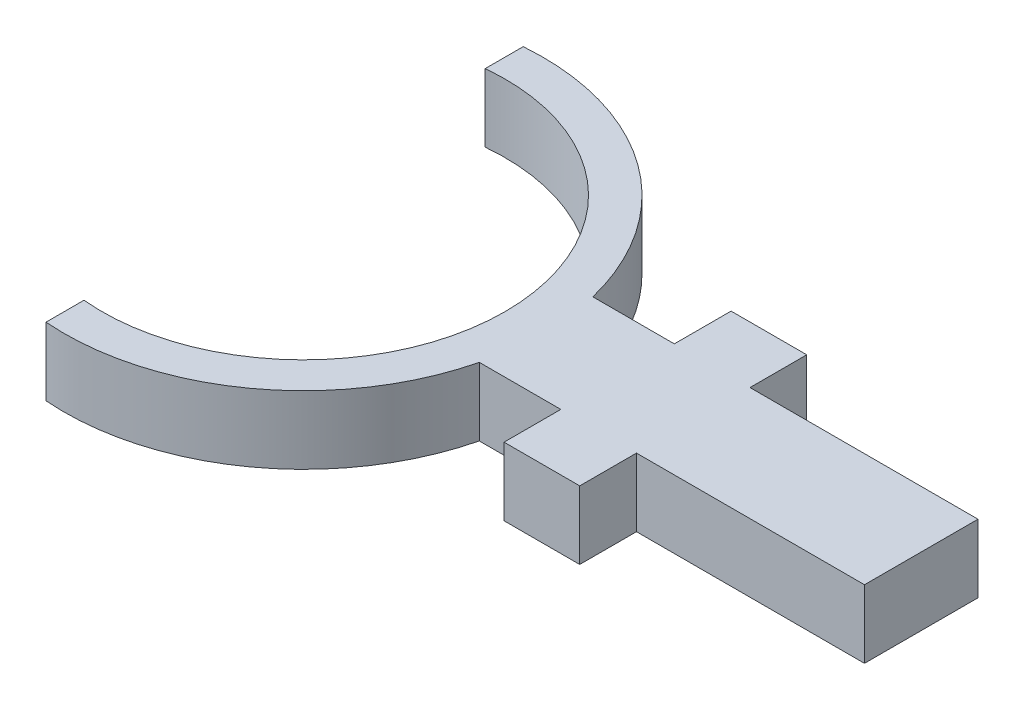
ISO-10303-21;
HEADER;
FILE_DESCRIPTION(('STEP AP214'),'2;1');
FILE_NAME('part.step','',(''),(''),'','','');
FILE_SCHEMA(('AUTOMOTIVE_DESIGN { 1 0 10303 214 1 1 1 1 }'));
ENDSEC;
DATA;
#1=APPLICATION_CONTEXT('core data for automotive mechanical design processes');
#2=APPLICATION_PROTOCOL_DEFINITION('international standard','automotive_design',2000,#1);
#3=PRODUCT_CONTEXT('',#1,'mechanical');
#4=PRODUCT('Part','Part','',(#3));
#5=PRODUCT_RELATED_PRODUCT_CATEGORY('part','',(#4));
#6=PRODUCT_DEFINITION_FORMATION('','',#4);
#7=PRODUCT_DEFINITION_CONTEXT('part definition',#1,'design');
#8=PRODUCT_DEFINITION('design','',#6,#7);
#9=PRODUCT_DEFINITION_SHAPE('','',#8);
#10=(LENGTH_UNIT() NAMED_UNIT(*) SI_UNIT(.MILLI.,.METRE.));
#11=(NAMED_UNIT(*) PLANE_ANGLE_UNIT() SI_UNIT($,.RADIAN.));
#12=(NAMED_UNIT(*) SI_UNIT($,.STERADIAN.) SOLID_ANGLE_UNIT());
#13=UNCERTAINTY_MEASURE_WITH_UNIT(LENGTH_MEASURE(1.E-05),#10,'distance_accuracy_value','');
#14=(GEOMETRIC_REPRESENTATION_CONTEXT(3) GLOBAL_UNCERTAINTY_ASSIGNED_CONTEXT((#13)) GLOBAL_UNIT_ASSIGNED_CONTEXT((#10,
#11,#12)) REPRESENTATION_CONTEXT('',''));
#15=CARTESIAN_POINT('',(0.,0.,0.));
#16=DIRECTION('',(0.,0.,1.));
#17=DIRECTION('',(1.,0.,0.));
#18=AXIS2_PLACEMENT_3D('',#15,#16,#17);
#19=CARTESIAN_POINT('',(5.82615267205284,1.8,1.5));
#20=DIRECTION('',(0.,0.,1.));
#21=DIRECTION('',(0.,-1.,0.));
#22=AXIS2_PLACEMENT_3D('',#19,#20,#21);
#23=PLANE('',#22);
#24=DIRECTION('',(0.,1.,0.));
#25=VECTOR('',#24,1.);
#26=CARTESIAN_POINT('',(10.3,1.8,1.5));
#27=LINE('',#26,#25);
#28=CARTESIAN_POINT('',(10.3,0.,1.5));
#29=VERTEX_POINT('',#28);
#30=CARTESIAN_POINT('',(10.3,1.8,1.5));
#31=VERTEX_POINT('',#30);
#32=EDGE_CURVE('E194',#29,#31,#27,.T.);
#33=ORIENTED_EDGE('',*,*,#32,.F.);
#34=DIRECTION('',(1.,0.,0.));
#35=VECTOR('',#34,1.);
#36=CARTESIAN_POINT('',(5.82615267205284,0.,1.5));
#37=LINE('',#36,#35);
#38=CARTESIAN_POINT('',(16.3261526720528,0.,1.5));
#39=VERTEX_POINT('',#38);
#40=EDGE_CURVE('E224',#29,#39,#37,.T.);
#41=ORIENTED_EDGE('',*,*,#40,.T.);
#42=DIRECTION('',(0.,-1.,0.));
#43=VECTOR('',#42,1.);
#44=CARTESIAN_POINT('',(16.3261526720528,1.8,1.5));
#45=LINE('',#44,#43);
#46=CARTESIAN_POINT('',(16.3261526720528,1.8,1.5));
#47=VERTEX_POINT('',#46);
#48=EDGE_CURVE('E212',#47,#39,#45,.T.);
#49=ORIENTED_EDGE('',*,*,#48,.F.);
#50=DIRECTION('',(1.,0.,0.));
#51=VECTOR('',#50,1.);
#52=CARTESIAN_POINT('',(5.82615267205284,1.8,1.5));
#53=LINE('',#52,#51);
#54=EDGE_CURVE('E50',#31,#47,#53,.T.);
#55=ORIENTED_EDGE('',*,*,#54,.F.);
#56=EDGE_LOOP('',(#33,#41,#49,#55));
#57=FACE_BOUND('',#56,.T.);
#58=ADVANCED_FACE('F35',(#57),#23,.T.);
#59=CARTESIAN_POINT('',(5.82615267205284,1.8,-1.5));
#60=DIRECTION('',(0.,0.,-1.));
#61=DIRECTION('',(0.,1.,0.));
#62=AXIS2_PLACEMENT_3D('',#59,#60,#61);
#63=PLANE('',#62);
#64=DIRECTION('',(0.,-1.,0.));
#65=VECTOR('',#64,1.);
#66=CARTESIAN_POINT('',(10.3,1.8,-1.5));
#67=LINE('',#66,#65);
#68=CARTESIAN_POINT('',(10.3,1.8,-1.5));
#69=VERTEX_POINT('',#68);
#70=CARTESIAN_POINT('',(10.3,0.,-1.5));
#71=VERTEX_POINT('',#70);
#72=EDGE_CURVE('E11',#69,#71,#67,.T.);
#73=ORIENTED_EDGE('',*,*,#72,.F.);
#74=DIRECTION('',(1.,0.,0.));
#75=VECTOR('',#74,1.);
#76=CARTESIAN_POINT('',(5.82615267205284,1.8,-1.5));
#77=LINE('',#76,#75);
#78=CARTESIAN_POINT('',(16.3261526720528,1.8,-1.5));
#79=VERTEX_POINT('',#78);
#80=EDGE_CURVE('E157',#69,#79,#77,.T.);
#81=ORIENTED_EDGE('',*,*,#80,.T.);
#82=DIRECTION('',(0.,1.,0.));
#83=VECTOR('',#82,1.);
#84=CARTESIAN_POINT('',(16.3261526720528,1.8,-1.5));
#85=LINE('',#84,#83);
#86=CARTESIAN_POINT('',(16.3261526720528,0.,-1.5));
#87=VERTEX_POINT('',#86);
#88=EDGE_CURVE('E218',#87,#79,#85,.T.);
#89=ORIENTED_EDGE('',*,*,#88,.F.);
#90=DIRECTION('',(1.,0.,0.));
#91=VECTOR('',#90,1.);
#92=CARTESIAN_POINT('',(5.82615267205284,0.,-1.5));
#93=LINE('',#92,#91);
#94=EDGE_CURVE('E234',#71,#87,#93,.T.);
#95=ORIENTED_EDGE('',*,*,#94,.F.);
#96=EDGE_LOOP('',(#73,#81,#89,#95));
#97=FACE_BOUND('',#96,.T.);
#98=ADVANCED_FACE('F309',(#97),#63,.T.);
#99=CARTESIAN_POINT('',(0.,1.8,0.));
#100=DIRECTION('',(0.,-1.,0.));
#101=DIRECTION('',(0.,0.,-1.));
#102=AXIS2_PLACEMENT_3D('',#99,#100,#101);
#103=CYLINDRICAL_SURFACE('',#102,6.32615267205284);
#104=CARTESIAN_POINT('',(0.,1.8,0.));
#105=DIRECTION('',(0.,1.,0.));
#106=DIRECTION('',(0.,0.,1.));
#107=AXIS2_PLACEMENT_3D('',#104,#105,#106);
#108=CIRCLE('',#107,6.32615267205284);
#109=CARTESIAN_POINT('',(-0.499999999999999,1.8,6.30636247214837));
#110=VERTEX_POINT('',#109);
#111=CARTESIAN_POINT('',(6.14574711732604,1.8,1.5));
#112=VERTEX_POINT('',#111);
#113=EDGE_CURVE('E247',#110,#112,#108,.T.);
#114=ORIENTED_EDGE('',*,*,#113,.F.);
#115=DIRECTION('',(0.,-1.,0.));
#116=VECTOR('',#115,1.);
#117=CARTESIAN_POINT('',(-0.499999999999999,1.8,6.30636247214837));
#118=LINE('',#117,#116);
#119=CARTESIAN_POINT('',(-0.499999999999999,0.,6.30636247214837));
#120=VERTEX_POINT('',#119);
#121=EDGE_CURVE('E204',#120,#110,#118,.F.);
#122=ORIENTED_EDGE('',*,*,#121,.F.);
#123=CARTESIAN_POINT('',(0.,0.,0.));
#124=DIRECTION('',(0.,1.,0.));
#125=DIRECTION('',(0.,0.,1.));
#126=AXIS2_PLACEMENT_3D('',#123,#124,#125);
#127=CIRCLE('',#126,6.32615267205284);
#128=CARTESIAN_POINT('',(6.14574711732604,0.,1.5));
#129=VERTEX_POINT('',#128);
#130=EDGE_CURVE('E240',#120,#129,#127,.T.);
#131=ORIENTED_EDGE('',*,*,#130,.T.);
#132=DIRECTION('',(0.,-1.,0.));
#133=VECTOR('',#132,1.);
#134=CARTESIAN_POINT('',(6.14574711732604,1.8,1.5));
#135=LINE('',#134,#133);
#136=EDGE_CURVE('E253',#129,#112,#135,.F.);
#137=ORIENTED_EDGE('',*,*,#136,.T.);
#138=EDGE_LOOP('',(#114,#122,#131,#137));
#139=FACE_BOUND('',#138,.T.);
#140=ADVANCED_FACE('F285',(#139),#103,.T.);
#141=CARTESIAN_POINT('',(0.,1.8,0.));
#142=DIRECTION('',(0.,1.,0.));
#143=DIRECTION('',(0.,0.,1.));
#144=AXIS2_PLACEMENT_3D('',#141,#142,#143);
#145=PLANE('',#144);
#146=CARTESIAN_POINT('',(8.3,1.8,1.5));
#147=VERTEX_POINT('',#146);
#148=EDGE_CURVE('E225',#112,#147,#53,.T.);
#149=ORIENTED_EDGE('',*,*,#148,.T.);
#150=DIRECTION('',(0.,0.,1.));
#151=VECTOR('',#150,1.);
#152=CARTESIAN_POINT('',(8.3,1.8,-3.));
#153=LINE('',#152,#151);
#154=CARTESIAN_POINT('',(8.3,1.8,3.));
#155=VERTEX_POINT('',#154);
#156=EDGE_CURVE('E175',#147,#155,#153,.T.);
#157=ORIENTED_EDGE('',*,*,#156,.T.);
#158=DIRECTION('',(1.,0.,0.));
#159=VECTOR('',#158,1.);
#160=CARTESIAN_POINT('',(10.3,1.8,3.));
#161=LINE('',#160,#159);
#162=CARTESIAN_POINT('',(10.3,1.8,3.));
#163=VERTEX_POINT('',#162);
#164=EDGE_CURVE('E170',#155,#163,#161,.T.);
#165=ORIENTED_EDGE('',*,*,#164,.T.);
#166=DIRECTION('',(0.,0.,-1.));
#167=VECTOR('',#166,1.);
#168=CARTESIAN_POINT('',(10.3,1.8,-3.));
#169=LINE('',#168,#167);
#170=EDGE_CURVE('E160',#163,#31,#169,.T.);
#171=ORIENTED_EDGE('',*,*,#170,.T.);
#172=ORIENTED_EDGE('',*,*,#54,.T.);
#173=DIRECTION('',(0.,0.,1.));
#174=VECTOR('',#173,1.);
#175=CARTESIAN_POINT('',(16.3261526720528,1.8,1.5));
#176=LINE('',#175,#174);
#177=EDGE_CURVE('E221',#79,#47,#176,.T.);
#178=ORIENTED_EDGE('',*,*,#177,.F.);
#179=ORIENTED_EDGE('',*,*,#80,.F.);
#180=CARTESIAN_POINT('',(10.3,1.8,-3.));
#181=VERTEX_POINT('',#180);
#182=EDGE_CURVE('E150',#69,#181,#169,.T.);
#183=ORIENTED_EDGE('',*,*,#182,.T.);
#184=DIRECTION('',(-1.,0.,0.));
#185=VECTOR('',#184,1.);
#186=CARTESIAN_POINT('',(10.3,1.8,-3.));
#187=LINE('',#186,#185);
#188=CARTESIAN_POINT('',(8.3,1.8,-3.));
#189=VERTEX_POINT('',#188);
#190=EDGE_CURVE('E155',#181,#189,#187,.T.);
#191=ORIENTED_EDGE('',*,*,#190,.T.);
#192=CARTESIAN_POINT('',(8.3,1.8,-1.5));
#193=VERTEX_POINT('',#192);
#194=EDGE_CURVE('E177',#189,#193,#153,.T.);
#195=ORIENTED_EDGE('',*,*,#194,.T.);
#196=CARTESIAN_POINT('',(6.14574711732604,1.8,-1.5));
#197=VERTEX_POINT('',#196);
#198=EDGE_CURVE('E228',#197,#193,#77,.T.);
#199=ORIENTED_EDGE('',*,*,#198,.F.);
#200=CARTESIAN_POINT('',(-0.5,1.8,-6.30636247214837));
#201=VERTEX_POINT('',#200);
#202=EDGE_CURVE('E243',#197,#201,#108,.T.);
#203=ORIENTED_EDGE('',*,*,#202,.T.);
#204=DIRECTION('',(0.,0.,-1.));
#205=VECTOR('',#204,1.);
#206=CARTESIAN_POINT('',(-0.5,1.8,-7.53956639783701));
#207=LINE('',#206,#205);
#208=CARTESIAN_POINT('',(-0.5,1.8,-5.30263163778285));
#209=VERTEX_POINT('',#208);
#210=EDGE_CURVE('E206',#209,#201,#207,.T.);
#211=ORIENTED_EDGE('',*,*,#210,.F.);
#212=CARTESIAN_POINT('',(0.,1.8,0.));
#213=DIRECTION('',(0.,1.,0.));
#214=DIRECTION('',(0.,0.,1.));
#215=AXIS2_PLACEMENT_3D('',#212,#213,#214);
#216=CIRCLE('',#215,5.32615267205284);
#217=CARTESIAN_POINT('',(-0.499999999999999,1.8,5.30263163778285));
#218=VERTEX_POINT('',#217);
#219=EDGE_CURVE('E237',#218,#209,#216,.T.);
#220=ORIENTED_EDGE('',*,*,#219,.F.);
#221=EDGE_CURVE('E208',#110,#218,#207,.T.);
#222=ORIENTED_EDGE('',*,*,#221,.F.);
#223=ORIENTED_EDGE('',*,*,#113,.T.);
#224=EDGE_LOOP('',(#149,#157,#165,#171,#172,#178,#179,#183,#191,#195,#199,#203,#211,#220,#222,#223));
#225=FACE_BOUND('',#224,.T.);
#226=ADVANCED_FACE('F152',(#225),#145,.T.);
#227=CARTESIAN_POINT('',(0.,0.,0.));
#228=DIRECTION('',(0.,1.,0.));
#229=DIRECTION('',(0.,0.,1.));
#230=AXIS2_PLACEMENT_3D('',#227,#228,#229);
#231=PLANE('',#230);
#232=CARTESIAN_POINT('',(6.14574711732604,0.,-1.5));
#233=VERTEX_POINT('',#232);
#234=CARTESIAN_POINT('',(8.3,0.,-1.5));
#235=VERTEX_POINT('',#234);
#236=EDGE_CURVE('E231',#233,#235,#93,.T.);
#237=ORIENTED_EDGE('',*,*,#236,.T.);
#238=DIRECTION('',(0.,0.,-1.));
#239=VECTOR('',#238,1.);
#240=CARTESIAN_POINT('',(8.3,0.,-3.));
#241=LINE('',#240,#239);
#242=CARTESIAN_POINT('',(8.3,0.,-3.));
#243=VERTEX_POINT('',#242);
#244=EDGE_CURVE('E186',#235,#243,#241,.T.);
#245=ORIENTED_EDGE('',*,*,#244,.T.);
#246=DIRECTION('',(1.,0.,0.));
#247=VECTOR('',#246,1.);
#248=CARTESIAN_POINT('',(10.3,0.,-3.));
#249=LINE('',#248,#247);
#250=CARTESIAN_POINT('',(10.3,0.,-3.));
#251=VERTEX_POINT('',#250);
#252=EDGE_CURVE('E191',#243,#251,#249,.T.);
#253=ORIENTED_EDGE('',*,*,#252,.T.);
#254=DIRECTION('',(0.,0.,1.));
#255=VECTOR('',#254,1.);
#256=CARTESIAN_POINT('',(10.3,0.,-3.));
#257=LINE('',#256,#255);
#258=EDGE_CURVE('E166',#251,#71,#257,.T.);
#259=ORIENTED_EDGE('',*,*,#258,.T.);
#260=ORIENTED_EDGE('',*,*,#94,.T.);
#261=DIRECTION('',(0.,0.,-1.));
#262=VECTOR('',#261,1.);
#263=CARTESIAN_POINT('',(16.3261526720528,0.,1.5));
#264=LINE('',#263,#262);
#265=EDGE_CURVE('E215',#39,#87,#264,.T.);
#266=ORIENTED_EDGE('',*,*,#265,.F.);
#267=ORIENTED_EDGE('',*,*,#40,.F.);
#268=CARTESIAN_POINT('',(10.3,0.,3.));
#269=VERTEX_POINT('',#268);
#270=EDGE_CURVE('E302',#29,#269,#257,.T.);
#271=ORIENTED_EDGE('',*,*,#270,.T.);
#272=DIRECTION('',(-1.,0.,0.));
#273=VECTOR('',#272,1.);
#274=CARTESIAN_POINT('',(10.3,0.,3.));
#275=LINE('',#274,#273);
#276=CARTESIAN_POINT('',(8.3,0.,3.));
#277=VERTEX_POINT('',#276);
#278=EDGE_CURVE('E460',#269,#277,#275,.T.);
#279=ORIENTED_EDGE('',*,*,#278,.T.);
#280=CARTESIAN_POINT('',(8.3,0.,1.5));
#281=VERTEX_POINT('',#280);
#282=EDGE_CURVE('E293',#277,#281,#241,.T.);
#283=ORIENTED_EDGE('',*,*,#282,.T.);
#284=EDGE_CURVE('E235',#129,#281,#37,.T.);
#285=ORIENTED_EDGE('',*,*,#284,.F.);
#286=ORIENTED_EDGE('',*,*,#130,.F.);
#287=DIRECTION('',(0.,0.,1.));
#288=VECTOR('',#287,1.);
#289=CARTESIAN_POINT('',(-0.5,0.,-7.53956639783701));
#290=LINE('',#289,#288);
#291=CARTESIAN_POINT('',(-0.499999999999999,0.,5.30263163778285));
#292=VERTEX_POINT('',#291);
#293=EDGE_CURVE('E211',#292,#120,#290,.T.);
#294=ORIENTED_EDGE('',*,*,#293,.F.);
#295=CARTESIAN_POINT('',(0.,0.,0.));
#296=DIRECTION('',(0.,1.,0.));
#297=DIRECTION('',(0.,0.,1.));
#298=AXIS2_PLACEMENT_3D('',#295,#296,#297);
#299=CIRCLE('',#298,5.32615267205284);
#300=CARTESIAN_POINT('',(-0.5,0.,-5.30263163778285));
#301=VERTEX_POINT('',#300);
#302=EDGE_CURVE('E227',#292,#301,#299,.T.);
#303=ORIENTED_EDGE('',*,*,#302,.T.);
#304=CARTESIAN_POINT('',(-0.5,0.,-6.30636247214837));
#305=VERTEX_POINT('',#304);
#306=EDGE_CURVE('E209',#305,#301,#290,.T.);
#307=ORIENTED_EDGE('',*,*,#306,.F.);
#308=EDGE_CURVE('E248',#233,#305,#127,.T.);
#309=ORIENTED_EDGE('',*,*,#308,.F.);
#310=EDGE_LOOP('',(#237,#245,#253,#259,#260,#266,#267,#271,#279,#283,#285,#286,#294,#303,#307,#309));
#311=FACE_BOUND('',#310,.T.);
#312=ADVANCED_FACE('F278',(#311),#231,.F.);
#313=ORIENTED_EDGE('',*,*,#308,.T.);
#314=DIRECTION('',(0.,-1.,0.));
#315=VECTOR('',#314,1.);
#316=CARTESIAN_POINT('',(-0.5,1.8,-6.30636247214837));
#317=LINE('',#316,#315);
#318=EDGE_CURVE('E202',#201,#305,#317,.T.);
#319=ORIENTED_EDGE('',*,*,#318,.F.);
#320=ORIENTED_EDGE('',*,*,#202,.F.);
#321=DIRECTION('',(0.,-1.,0.));
#322=VECTOR('',#321,1.);
#323=CARTESIAN_POINT('',(6.14574711732604,1.8,-1.5));
#324=LINE('',#323,#322);
#325=EDGE_CURVE('E246',#197,#233,#324,.T.);
#326=ORIENTED_EDGE('',*,*,#325,.T.);
#327=EDGE_LOOP('',(#313,#319,#320,#326));
#328=FACE_BOUND('',#327,.T.);
#329=ADVANCED_FACE('F37',(#328),#103,.T.);
#330=CARTESIAN_POINT('',(0.,1.8,0.));
#331=DIRECTION('',(0.,-1.,0.));
#332=DIRECTION('',(0.,0.,-1.));
#333=AXIS2_PLACEMENT_3D('',#330,#331,#332);
#334=CYLINDRICAL_SURFACE('',#333,5.32615267205284);
#335=DIRECTION('',(0.,-1.,0.));
#336=VECTOR('',#335,1.);
#337=CARTESIAN_POINT('',(-0.499999999999999,1.8,5.30263163778285));
#338=LINE('',#337,#336);
#339=EDGE_CURVE('E199',#292,#218,#338,.F.);
#340=ORIENTED_EDGE('',*,*,#339,.T.);
#341=ORIENTED_EDGE('',*,*,#219,.T.);
#342=DIRECTION('',(0.,-1.,0.));
#343=VECTOR('',#342,1.);
#344=CARTESIAN_POINT('',(-0.5,1.8,-5.30263163778285));
#345=LINE('',#344,#343);
#346=EDGE_CURVE('E196',#209,#301,#345,.T.);
#347=ORIENTED_EDGE('',*,*,#346,.T.);
#348=ORIENTED_EDGE('',*,*,#302,.F.);
#349=EDGE_LOOP('',(#340,#341,#347,#348));
#350=FACE_BOUND('',#349,.T.);
#351=ADVANCED_FACE('F270',(#350),#334,.F.);
#352=DIRECTION('',(0.,-1.,0.));
#353=VECTOR('',#352,1.);
#354=CARTESIAN_POINT('',(8.3,1.8,1.5));
#355=LINE('',#354,#353);
#356=EDGE_CURVE('E58',#147,#281,#355,.T.);
#357=ORIENTED_EDGE('',*,*,#356,.F.);
#358=ORIENTED_EDGE('',*,*,#148,.F.);
#359=ORIENTED_EDGE('',*,*,#136,.F.);
#360=ORIENTED_EDGE('',*,*,#284,.T.);
#361=EDGE_LOOP('',(#357,#358,#359,#360));
#362=FACE_BOUND('',#361,.T.);
#363=ADVANCED_FACE('F286',(#362),#23,.T.);
#364=DIRECTION('',(0.,1.,0.));
#365=VECTOR('',#364,1.);
#366=CARTESIAN_POINT('',(8.3,1.8,-1.5));
#367=LINE('',#366,#365);
#368=EDGE_CURVE('E43',#235,#193,#367,.T.);
#369=ORIENTED_EDGE('',*,*,#368,.F.);
#370=ORIENTED_EDGE('',*,*,#236,.F.);
#371=ORIENTED_EDGE('',*,*,#325,.F.);
#372=ORIENTED_EDGE('',*,*,#198,.T.);
#373=EDGE_LOOP('',(#369,#370,#371,#372));
#374=FACE_BOUND('',#373,.T.);
#375=ADVANCED_FACE('F262',(#374),#63,.T.);
#376=CARTESIAN_POINT('',(16.3261526720528,0.,0.));
#377=DIRECTION('',(1.,0.,0.));
#378=DIRECTION('',(0.,0.,-1.));
#379=AXIS2_PLACEMENT_3D('',#376,#377,#378);
#380=PLANE('',#379);
#381=ORIENTED_EDGE('',*,*,#48,.T.);
#382=ORIENTED_EDGE('',*,*,#265,.T.);
#383=ORIENTED_EDGE('',*,*,#88,.T.);
#384=ORIENTED_EDGE('',*,*,#177,.T.);
#385=EDGE_LOOP('',(#381,#382,#383,#384));
#386=FACE_BOUND('',#385,.T.);
#387=ADVANCED_FACE('F307',(#386),#380,.T.);
#388=CARTESIAN_POINT('',(-0.5,-0.000999999999999916,-7.53956639783701));
#389=DIRECTION('',(1.,0.,0.));
#390=DIRECTION('',(0.,0.,-1.));
#391=AXIS2_PLACEMENT_3D('',#388,#389,#390);
#392=PLANE('',#391);
#393=ORIENTED_EDGE('',*,*,#318,.T.);
#394=ORIENTED_EDGE('',*,*,#306,.T.);
#395=ORIENTED_EDGE('',*,*,#346,.F.);
#396=ORIENTED_EDGE('',*,*,#210,.T.);
#397=EDGE_LOOP('',(#393,#394,#395,#396));
#398=FACE_BOUND('',#397,.T.);
#399=ADVANCED_FACE('F323',(#398),#392,.F.);
#400=ORIENTED_EDGE('',*,*,#121,.T.);
#401=ORIENTED_EDGE('',*,*,#221,.T.);
#402=ORIENTED_EDGE('',*,*,#339,.F.);
#403=ORIENTED_EDGE('',*,*,#293,.T.);
#404=EDGE_LOOP('',(#400,#401,#402,#403));
#405=FACE_BOUND('',#404,.T.);
#406=ADVANCED_FACE('F274',(#405),#392,.F.);
#407=CARTESIAN_POINT('',(10.3,-6.32455532033676,-3.));
#408=DIRECTION('',(0.,0.,-1.));
#409=DIRECTION('',(-1.,0.,0.));
#410=AXIS2_PLACEMENT_3D('',#407,#408,#409);
#411=PLANE('',#410);
#412=ORIENTED_EDGE('',*,*,#252,.F.);
#413=DIRECTION('',(0.,1.,0.));
#414=VECTOR('',#413,1.);
#415=CARTESIAN_POINT('',(8.3,-6.32455532033676,-3.));
#416=LINE('',#415,#414);
#417=EDGE_CURVE('E169',#243,#189,#416,.T.);
#418=ORIENTED_EDGE('',*,*,#417,.T.);
#419=ORIENTED_EDGE('',*,*,#190,.F.);
#420=DIRECTION('',(0.,1.,0.));
#421=VECTOR('',#420,1.);
#422=CARTESIAN_POINT('',(10.3,-6.32455532033676,-3.));
#423=LINE('',#422,#421);
#424=EDGE_CURVE('E164',#251,#181,#423,.T.);
#425=ORIENTED_EDGE('',*,*,#424,.F.);
#426=EDGE_LOOP('',(#412,#418,#419,#425));
#427=FACE_BOUND('',#426,.T.);
#428=ADVANCED_FACE('F172',(#427),#411,.T.);
#429=CARTESIAN_POINT('',(8.3,-6.32455532033676,-3.));
#430=DIRECTION('',(-1.,0.,0.));
#431=DIRECTION('',(0.,0.,1.));
#432=AXIS2_PLACEMENT_3D('',#429,#430,#431);
#433=PLANE('',#432);
#434=ORIENTED_EDGE('',*,*,#244,.F.);
#435=ORIENTED_EDGE('',*,*,#368,.T.);
#436=ORIENTED_EDGE('',*,*,#194,.F.);
#437=ORIENTED_EDGE('',*,*,#417,.F.);
#438=EDGE_LOOP('',(#434,#435,#436,#437));
#439=FACE_BOUND('',#438,.T.);
#440=ADVANCED_FACE('F257',(#439),#433,.T.);
#441=CARTESIAN_POINT('',(10.3,-6.32455532033676,-3.));
#442=DIRECTION('',(1.,0.,0.));
#443=DIRECTION('',(0.,0.,-1.));
#444=AXIS2_PLACEMENT_3D('',#441,#442,#443);
#445=PLANE('',#444);
#446=ORIENTED_EDGE('',*,*,#182,.F.);
#447=ORIENTED_EDGE('',*,*,#72,.T.);
#448=ORIENTED_EDGE('',*,*,#258,.F.);
#449=ORIENTED_EDGE('',*,*,#424,.T.);
#450=EDGE_LOOP('',(#446,#447,#448,#449));
#451=FACE_BOUND('',#450,.T.);
#452=ADVANCED_FACE('F165',(#451),#445,.T.);
#453=ORIENTED_EDGE('',*,*,#270,.F.);
#454=ORIENTED_EDGE('',*,*,#32,.T.);
#455=ORIENTED_EDGE('',*,*,#170,.F.);
#456=DIRECTION('',(0.,1.,0.));
#457=VECTOR('',#456,1.);
#458=CARTESIAN_POINT('',(10.3,-6.32455532033676,3.));
#459=LINE('',#458,#457);
#460=EDGE_CURVE('E184',#269,#163,#459,.T.);
#461=ORIENTED_EDGE('',*,*,#460,.F.);
#462=EDGE_LOOP('',(#453,#454,#455,#461));
#463=FACE_BOUND('',#462,.T.);
#464=ADVANCED_FACE('F301',(#463),#445,.T.);
#465=ORIENTED_EDGE('',*,*,#156,.F.);
#466=ORIENTED_EDGE('',*,*,#356,.T.);
#467=ORIENTED_EDGE('',*,*,#282,.F.);
#468=DIRECTION('',(0.,1.,0.));
#469=VECTOR('',#468,1.);
#470=CARTESIAN_POINT('',(8.3,-6.32455532033676,3.));
#471=LINE('',#470,#469);
#472=EDGE_CURVE('E187',#277,#155,#471,.T.);
#473=ORIENTED_EDGE('',*,*,#472,.T.);
#474=EDGE_LOOP('',(#465,#466,#467,#473));
#475=FACE_BOUND('',#474,.T.);
#476=ADVANCED_FACE('F289',(#475),#433,.T.);
#477=CARTESIAN_POINT('',(10.3,-6.32455532033676,3.));
#478=DIRECTION('',(0.,0.,1.));
#479=DIRECTION('',(1.,0.,0.));
#480=AXIS2_PLACEMENT_3D('',#477,#478,#479);
#481=PLANE('',#480);
#482=ORIENTED_EDGE('',*,*,#278,.F.);
#483=ORIENTED_EDGE('',*,*,#460,.T.);
#484=ORIENTED_EDGE('',*,*,#164,.F.);
#485=ORIENTED_EDGE('',*,*,#472,.F.);
#486=EDGE_LOOP('',(#482,#483,#484,#485));
#487=FACE_BOUND('',#486,.T.);
#488=ADVANCED_FACE('F296',(#487),#481,.T.);
#489=CLOSED_SHELL('',(#58,#98,#140,#226,#312,#329,#351,#363,#375,#387,#399,#406,#428,#440,#452,
#464,#476,#488));
#490=MANIFOLD_SOLID_BREP('B2',#489);
#491=ADVANCED_BREP_SHAPE_REPRESENTATION('',(#18,#490),#14);
#492=SHAPE_DEFINITION_REPRESENTATION(#9,#491);
ENDSEC;
END-ISO-10303-21;
